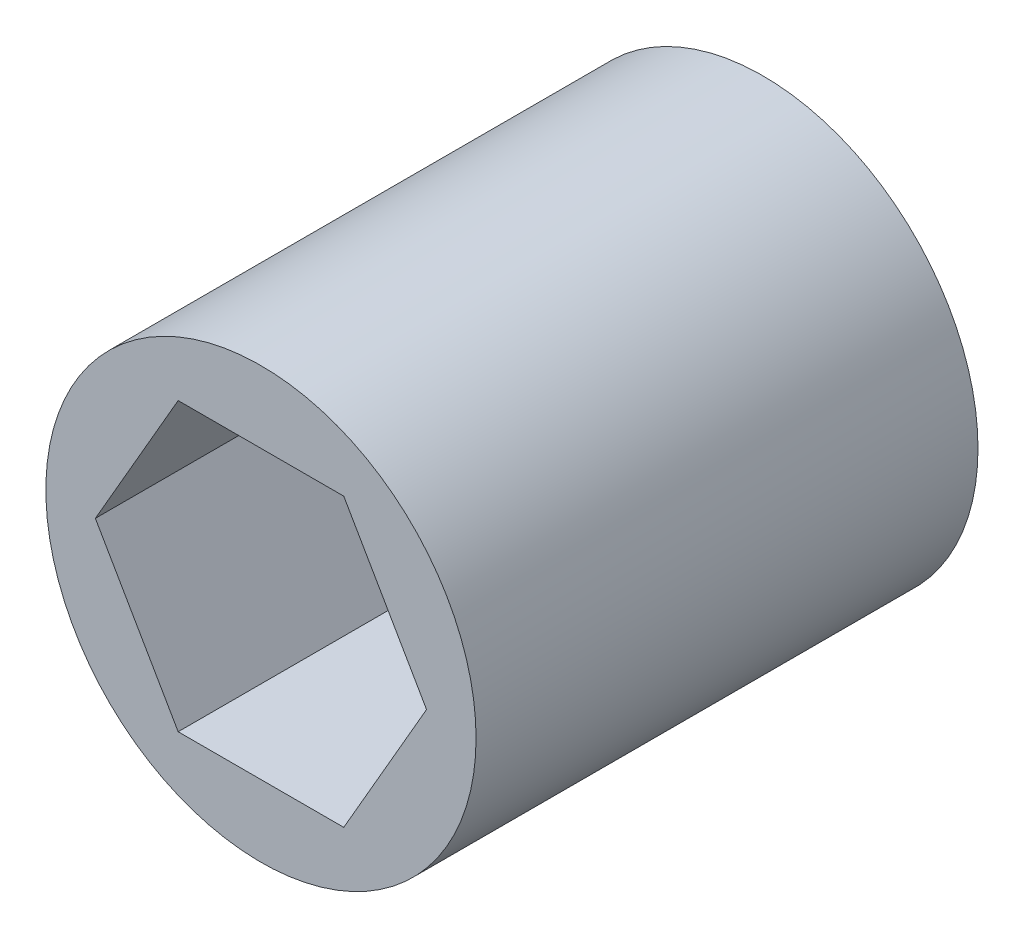
ISO-10303-21;
HEADER;
FILE_DESCRIPTION(('STEP AP214'),'2;1');
FILE_NAME('part.step','',(''),(''),'','','');
FILE_SCHEMA(('AUTOMOTIVE_DESIGN { 1 0 10303 214 1 1 1 1 }'));
ENDSEC;
DATA;
#1=APPLICATION_CONTEXT('core data for automotive mechanical design processes');
#2=APPLICATION_PROTOCOL_DEFINITION('international standard','automotive_design',2000,#1);
#3=PRODUCT_CONTEXT('',#1,'mechanical');
#4=PRODUCT('Part','Part','',(#3));
#5=PRODUCT_RELATED_PRODUCT_CATEGORY('part','',(#4));
#6=PRODUCT_DEFINITION_FORMATION('','',#4);
#7=PRODUCT_DEFINITION_CONTEXT('part definition',#1,'design');
#8=PRODUCT_DEFINITION('design','',#6,#7);
#9=PRODUCT_DEFINITION_SHAPE('','',#8);
#10=(LENGTH_UNIT() NAMED_UNIT(*) SI_UNIT(.MILLI.,.METRE.));
#11=(NAMED_UNIT(*) PLANE_ANGLE_UNIT() SI_UNIT($,.RADIAN.));
#12=(NAMED_UNIT(*) SI_UNIT($,.STERADIAN.) SOLID_ANGLE_UNIT());
#13=UNCERTAINTY_MEASURE_WITH_UNIT(LENGTH_MEASURE(1.E-05),#10,'distance_accuracy_value','');
#14=(GEOMETRIC_REPRESENTATION_CONTEXT(3) GLOBAL_UNCERTAINTY_ASSIGNED_CONTEXT((#13)) GLOBAL_UNIT_ASSIGNED_CONTEXT((#10,
#11,#12)) REPRESENTATION_CONTEXT('',''));
#15=CARTESIAN_POINT('',(0.,0.,0.));
#16=DIRECTION('',(0.,0.,1.));
#17=DIRECTION('',(1.,0.,0.));
#18=AXIS2_PLACEMENT_3D('',#15,#16,#17);
#19=CARTESIAN_POINT('',(0.,0.,22.225));
#20=DIRECTION('',(0.,0.,1.));
#21=DIRECTION('',(1.,0.,0.));
#22=AXIS2_PLACEMENT_3D('',#19,#20,#21);
#23=PLANE('',#22);
#24=CARTESIAN_POINT('',(0.,0.,22.225));
#25=DIRECTION('',(0.,0.,1.));
#26=DIRECTION('',(1.,0.,0.));
#27=AXIS2_PLACEMENT_3D('',#24,#25,#26);
#28=CIRCLE('',#27,9.525);
#29=CARTESIAN_POINT('',(9.525,0.,22.225));
#30=VERTEX_POINT('',#29);
#31=EDGE_CURVE('E11',#30,#30,#28,.T.);
#32=ORIENTED_EDGE('',*,*,#31,.T.);
#33=EDGE_LOOP('',(#32));
#34=FACE_BOUND('',#33,.T.);
#35=DIRECTION('',(-0.5,-0.866025403784439,0.));
#36=VECTOR('',#35,1.);
#37=CARTESIAN_POINT('',(-3.66617420935412,6.35,22.225));
#38=LINE('',#37,#36);
#39=CARTESIAN_POINT('',(-3.66617420935412,6.35,22.225));
#40=VERTEX_POINT('',#39);
#41=CARTESIAN_POINT('',(-7.33234841870825,0.,22.225));
#42=VERTEX_POINT('',#41);
#43=EDGE_CURVE('E98',#40,#42,#38,.T.);
#44=ORIENTED_EDGE('',*,*,#43,.F.);
#45=DIRECTION('',(-1.,0.,0.));
#46=VECTOR('',#45,1.);
#47=CARTESIAN_POINT('',(3.66617420935412,6.35,22.225));
#48=LINE('',#47,#46);
#49=CARTESIAN_POINT('',(3.66617420935412,6.35,22.225));
#50=VERTEX_POINT('',#49);
#51=EDGE_CURVE('E90',#50,#40,#48,.T.);
#52=ORIENTED_EDGE('',*,*,#51,.F.);
#53=DIRECTION('',(-0.5,0.866025403784439,0.));
#54=VECTOR('',#53,1.);
#55=CARTESIAN_POINT('',(7.33234841870825,0.,22.225));
#56=LINE('',#55,#54);
#57=CARTESIAN_POINT('',(7.33234841870825,0.,22.225));
#58=VERTEX_POINT('',#57);
#59=EDGE_CURVE('E118',#58,#50,#56,.T.);
#60=ORIENTED_EDGE('',*,*,#59,.F.);
#61=DIRECTION('',(0.5,0.866025403784439,0.));
#62=VECTOR('',#61,1.);
#63=CARTESIAN_POINT('',(3.66617420935413,-6.35,22.225));
#64=LINE('',#63,#62);
#65=CARTESIAN_POINT('',(3.66617420935413,-6.35,22.225));
#66=VERTEX_POINT('',#65);
#67=EDGE_CURVE('E116',#66,#58,#64,.T.);
#68=ORIENTED_EDGE('',*,*,#67,.F.);
#69=DIRECTION('',(1.,0.,0.));
#70=VECTOR('',#69,1.);
#71=CARTESIAN_POINT('',(-3.66617420935412,-6.35,22.225));
#72=LINE('',#71,#70);
#73=CARTESIAN_POINT('',(-3.66617420935412,-6.35,22.225));
#74=VERTEX_POINT('',#73);
#75=EDGE_CURVE('E112',#74,#66,#72,.T.);
#76=ORIENTED_EDGE('',*,*,#75,.F.);
#77=DIRECTION('',(0.5,-0.866025403784438,0.));
#78=VECTOR('',#77,1.);
#79=CARTESIAN_POINT('',(-7.33234841870825,0.,22.225));
#80=LINE('',#79,#78);
#81=EDGE_CURVE('E110',#42,#74,#80,.T.);
#82=ORIENTED_EDGE('',*,*,#81,.F.);
#83=EDGE_LOOP('',(#44,#52,#60,#68,#76,#82));
#84=FACE_BOUND('',#83,.T.);
#85=ADVANCED_FACE('F37',(#34,#84),#23,.T.);
#86=CARTESIAN_POINT('',(0.,0.,0.));
#87=DIRECTION('',(0.,0.,1.));
#88=DIRECTION('',(1.,0.,0.));
#89=AXIS2_PLACEMENT_3D('',#86,#87,#88);
#90=PLANE('',#89);
#91=CARTESIAN_POINT('',(0.,0.,0.));
#92=DIRECTION('',(0.,0.,1.));
#93=DIRECTION('',(1.,0.,0.));
#94=AXIS2_PLACEMENT_3D('',#91,#92,#93);
#95=CIRCLE('',#94,9.525);
#96=CARTESIAN_POINT('',(9.525,0.,0.));
#97=VERTEX_POINT('',#96);
#98=EDGE_CURVE('E41',#97,#97,#95,.T.);
#99=ORIENTED_EDGE('',*,*,#98,.F.);
#100=EDGE_LOOP('',(#99));
#101=FACE_BOUND('',#100,.T.);
#102=DIRECTION('',(-1.,0.,0.));
#103=VECTOR('',#102,1.);
#104=CARTESIAN_POINT('',(3.66617420935412,6.35,0.));
#105=LINE('',#104,#103);
#106=CARTESIAN_POINT('',(3.66617420935412,6.35,0.));
#107=VERTEX_POINT('',#106);
#108=CARTESIAN_POINT('',(-3.66617420935412,6.35,0.));
#109=VERTEX_POINT('',#108);
#110=EDGE_CURVE('E60',#107,#109,#105,.T.);
#111=ORIENTED_EDGE('',*,*,#110,.T.);
#112=DIRECTION('',(-0.5,-0.866025403784439,0.));
#113=VECTOR('',#112,1.);
#114=CARTESIAN_POINT('',(-3.66617420935412,6.35,0.));
#115=LINE('',#114,#113);
#116=CARTESIAN_POINT('',(-7.33234841870825,0.,0.));
#117=VERTEX_POINT('',#116);
#118=EDGE_CURVE('E105',#109,#117,#115,.T.);
#119=ORIENTED_EDGE('',*,*,#118,.T.);
#120=DIRECTION('',(0.5,-0.866025403784438,0.));
#121=VECTOR('',#120,1.);
#122=CARTESIAN_POINT('',(-7.33234841870825,0.,0.));
#123=LINE('',#122,#121);
#124=CARTESIAN_POINT('',(-3.66617420935412,-6.35,0.));
#125=VERTEX_POINT('',#124);
#126=EDGE_CURVE('E122',#117,#125,#123,.T.);
#127=ORIENTED_EDGE('',*,*,#126,.T.);
#128=DIRECTION('',(1.,0.,0.));
#129=VECTOR('',#128,1.);
#130=CARTESIAN_POINT('',(-3.66617420935412,-6.35,0.));
#131=LINE('',#130,#129);
#132=CARTESIAN_POINT('',(3.66617420935413,-6.35,0.));
#133=VERTEX_POINT('',#132);
#134=EDGE_CURVE('E125',#125,#133,#131,.T.);
#135=ORIENTED_EDGE('',*,*,#134,.T.);
#136=DIRECTION('',(0.5,0.866025403784439,0.));
#137=VECTOR('',#136,1.);
#138=CARTESIAN_POINT('',(3.66617420935413,-6.35,0.));
#139=LINE('',#138,#137);
#140=CARTESIAN_POINT('',(7.33234841870825,0.,0.));
#141=VERTEX_POINT('',#140);
#142=EDGE_CURVE('E128',#133,#141,#139,.T.);
#143=ORIENTED_EDGE('',*,*,#142,.T.);
#144=DIRECTION('',(-0.5,0.866025403784439,0.));
#145=VECTOR('',#144,1.);
#146=CARTESIAN_POINT('',(7.33234841870825,0.,0.));
#147=LINE('',#146,#145);
#148=EDGE_CURVE('E99',#141,#107,#147,.T.);
#149=ORIENTED_EDGE('',*,*,#148,.T.);
#150=EDGE_LOOP('',(#111,#119,#127,#135,#143,#149));
#151=FACE_BOUND('',#150,.T.);
#152=ADVANCED_FACE('F145',(#101,#151),#90,.F.);
#153=CARTESIAN_POINT('',(0.,0.,22.225));
#154=DIRECTION('',(0.,0.,-1.));
#155=DIRECTION('',(-1.,0.,0.));
#156=AXIS2_PLACEMENT_3D('',#153,#154,#155);
#157=CYLINDRICAL_SURFACE('',#156,9.525);
#158=ORIENTED_EDGE('',*,*,#31,.F.);
#159=EDGE_LOOP('',(#158));
#160=FACE_BOUND('',#159,.T.);
#161=ORIENTED_EDGE('',*,*,#98,.T.);
#162=EDGE_LOOP('',(#161));
#163=FACE_BOUND('',#162,.T.);
#164=ADVANCED_FACE('F39',(#160,#163),#157,.T.);
#165=CARTESIAN_POINT('',(3.66617420935412,6.35,22.225));
#166=DIRECTION('',(0.,-1.,0.));
#167=DIRECTION('',(1.,0.,0.));
#168=AXIS2_PLACEMENT_3D('',#165,#166,#167);
#169=PLANE('',#168);
#170=ORIENTED_EDGE('',*,*,#110,.F.);
#171=DIRECTION('',(0.,0.,-1.));
#172=VECTOR('',#171,1.);
#173=CARTESIAN_POINT('',(3.66617420935412,6.35,22.225));
#174=LINE('',#173,#172);
#175=EDGE_CURVE('E94',#50,#107,#174,.T.);
#176=ORIENTED_EDGE('',*,*,#175,.F.);
#177=ORIENTED_EDGE('',*,*,#51,.T.);
#178=DIRECTION('',(0.,0.,-1.));
#179=VECTOR('',#178,1.);
#180=CARTESIAN_POINT('',(-3.66617420935412,6.35,22.225));
#181=LINE('',#180,#179);
#182=EDGE_CURVE('E93',#40,#109,#181,.T.);
#183=ORIENTED_EDGE('',*,*,#182,.T.);
#184=EDGE_LOOP('',(#170,#176,#177,#183));
#185=FACE_BOUND('',#184,.T.);
#186=ADVANCED_FACE('F92',(#185),#169,.T.);
#187=CARTESIAN_POINT('',(-3.66617420935412,6.35,22.225));
#188=DIRECTION('',(0.866025403784439,-0.5,0.));
#189=DIRECTION('',(0.5,0.866025403784439,0.));
#190=AXIS2_PLACEMENT_3D('',#187,#188,#189);
#191=PLANE('',#190);
#192=ORIENTED_EDGE('',*,*,#118,.F.);
#193=ORIENTED_EDGE('',*,*,#182,.F.);
#194=ORIENTED_EDGE('',*,*,#43,.T.);
#195=DIRECTION('',(0.,0.,-1.));
#196=VECTOR('',#195,1.);
#197=CARTESIAN_POINT('',(-7.33234841870825,0.,22.225));
#198=LINE('',#197,#196);
#199=EDGE_CURVE('E106',#42,#117,#198,.T.);
#200=ORIENTED_EDGE('',*,*,#199,.T.);
#201=EDGE_LOOP('',(#192,#193,#194,#200));
#202=FACE_BOUND('',#201,.T.);
#203=ADVANCED_FACE('F102',(#202),#191,.T.);
#204=CARTESIAN_POINT('',(-7.33234841870825,0.,22.225));
#205=DIRECTION('',(0.866025403784438,0.5,0.));
#206=DIRECTION('',(-0.5,0.866025403784439,0.));
#207=AXIS2_PLACEMENT_3D('',#204,#205,#206);
#208=PLANE('',#207);
#209=ORIENTED_EDGE('',*,*,#126,.F.);
#210=ORIENTED_EDGE('',*,*,#199,.F.);
#211=ORIENTED_EDGE('',*,*,#81,.T.);
#212=DIRECTION('',(0.,0.,-1.));
#213=VECTOR('',#212,1.);
#214=CARTESIAN_POINT('',(-3.66617420935412,-6.35,22.225));
#215=LINE('',#214,#213);
#216=EDGE_CURVE('E137',#74,#125,#215,.T.);
#217=ORIENTED_EDGE('',*,*,#216,.T.);
#218=EDGE_LOOP('',(#209,#210,#211,#217));
#219=FACE_BOUND('',#218,.T.);
#220=ADVANCED_FACE('F141',(#219),#208,.T.);
#221=CARTESIAN_POINT('',(-3.66617420935412,-6.35,22.225));
#222=DIRECTION('',(0.,1.,0.));
#223=DIRECTION('',(-1.,0.,0.));
#224=AXIS2_PLACEMENT_3D('',#221,#222,#223);
#225=PLANE('',#224);
#226=ORIENTED_EDGE('',*,*,#134,.F.);
#227=ORIENTED_EDGE('',*,*,#216,.F.);
#228=ORIENTED_EDGE('',*,*,#75,.T.);
#229=DIRECTION('',(0.,0.,-1.));
#230=VECTOR('',#229,1.);
#231=CARTESIAN_POINT('',(3.66617420935413,-6.35,22.225));
#232=LINE('',#231,#230);
#233=EDGE_CURVE('E135',#66,#133,#232,.T.);
#234=ORIENTED_EDGE('',*,*,#233,.T.);
#235=EDGE_LOOP('',(#226,#227,#228,#234));
#236=FACE_BOUND('',#235,.T.);
#237=ADVANCED_FACE('F153',(#236),#225,.T.);
#238=CARTESIAN_POINT('',(3.66617420935413,-6.35,22.225));
#239=DIRECTION('',(-0.866025403784439,0.5,0.));
#240=DIRECTION('',(-0.5,-0.866025403784439,0.));
#241=AXIS2_PLACEMENT_3D('',#238,#239,#240);
#242=PLANE('',#241);
#243=ORIENTED_EDGE('',*,*,#142,.F.);
#244=ORIENTED_EDGE('',*,*,#233,.F.);
#245=ORIENTED_EDGE('',*,*,#67,.T.);
#246=DIRECTION('',(0.,0.,-1.));
#247=VECTOR('',#246,1.);
#248=CARTESIAN_POINT('',(7.33234841870825,0.,22.225));
#249=LINE('',#248,#247);
#250=EDGE_CURVE('E52',#58,#141,#249,.T.);
#251=ORIENTED_EDGE('',*,*,#250,.T.);
#252=EDGE_LOOP('',(#243,#244,#245,#251));
#253=FACE_BOUND('',#252,.T.);
#254=ADVANCED_FACE('F151',(#253),#242,.T.);
#255=CARTESIAN_POINT('',(7.33234841870825,0.,22.225));
#256=DIRECTION('',(-0.866025403784439,-0.5,0.));
#257=DIRECTION('',(0.5,-0.866025403784439,0.));
#258=AXIS2_PLACEMENT_3D('',#255,#256,#257);
#259=PLANE('',#258);
#260=ORIENTED_EDGE('',*,*,#148,.F.);
#261=ORIENTED_EDGE('',*,*,#250,.F.);
#262=ORIENTED_EDGE('',*,*,#59,.T.);
#263=ORIENTED_EDGE('',*,*,#175,.T.);
#264=EDGE_LOOP('',(#260,#261,#262,#263));
#265=FACE_BOUND('',#264,.T.);
#266=ADVANCED_FACE('F147',(#265),#259,.T.);
#267=CLOSED_SHELL('',(#85,#152,#164,#186,#203,#220,#237,#254,#266));
#268=MANIFOLD_SOLID_BREP('B2',#267);
#269=ADVANCED_BREP_SHAPE_REPRESENTATION('',(#18,#268),#14);
#270=SHAPE_DEFINITION_REPRESENTATION(#9,#269);
ENDSEC;
END-ISO-10303-21;
